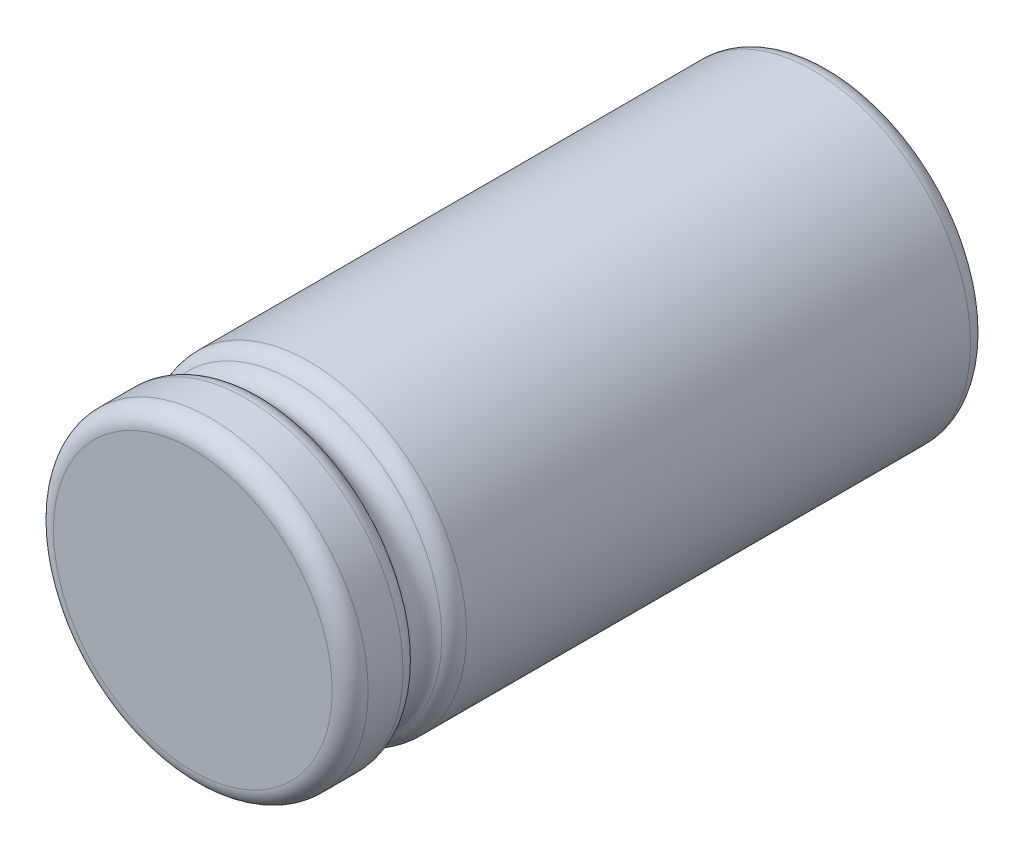
ISO-10303-21;
HEADER;
FILE_DESCRIPTION(('STEP AP214'),'2;1');
FILE_NAME('part.step','',(''),(''),'','','');
FILE_SCHEMA(('AUTOMOTIVE_DESIGN { 1 0 10303 214 1 1 1 1 }'));
ENDSEC;
DATA;
#1=APPLICATION_CONTEXT('core data for automotive mechanical design processes');
#2=APPLICATION_PROTOCOL_DEFINITION('international standard','automotive_design',2000,#1);
#3=PRODUCT_CONTEXT('',#1,'mechanical');
#4=PRODUCT('Part','Part','',(#3));
#5=PRODUCT_RELATED_PRODUCT_CATEGORY('part','',(#4));
#6=PRODUCT_DEFINITION_FORMATION('','',#4);
#7=PRODUCT_DEFINITION_CONTEXT('part definition',#1,'design');
#8=PRODUCT_DEFINITION('design','',#6,#7);
#9=PRODUCT_DEFINITION_SHAPE('','',#8);
#10=(LENGTH_UNIT() NAMED_UNIT(*) SI_UNIT(.MILLI.,.METRE.));
#11=(NAMED_UNIT(*) PLANE_ANGLE_UNIT() SI_UNIT($,.RADIAN.));
#12=(NAMED_UNIT(*) SI_UNIT($,.STERADIAN.) SOLID_ANGLE_UNIT());
#13=UNCERTAINTY_MEASURE_WITH_UNIT(LENGTH_MEASURE(1.E-05),#10,'distance_accuracy_value','');
#14=(GEOMETRIC_REPRESENTATION_CONTEXT(3) GLOBAL_UNCERTAINTY_ASSIGNED_CONTEXT((#13)) GLOBAL_UNIT_ASSIGNED_CONTEXT((#10,
#11,#12)) REPRESENTATION_CONTEXT('',''));
#15=CARTESIAN_POINT('',(0.,0.,0.));
#16=DIRECTION('',(0.,0.,1.));
#17=DIRECTION('',(1.,0.,0.));
#18=AXIS2_PLACEMENT_3D('',#15,#16,#17);
#19=CARTESIAN_POINT('',(0.,0.,71.));
#20=DIRECTION('',(0.,0.,-1.));
#21=DIRECTION('',(-1.,0.,0.));
#22=AXIS2_PLACEMENT_3D('',#19,#20,#21);
#23=CYLINDRICAL_SURFACE('',#22,17.5);
#24=CARTESIAN_POINT('',(0.,0.,58.0557806851903));
#25=DIRECTION('',(0.,0.,-1.));
#26=DIRECTION('',(-1.,0.,0.));
#27=AXIS2_PLACEMENT_3D('',#24,#25,#26);
#28=CIRCLE('',#27,17.5);
#29=CARTESIAN_POINT('',(17.5,0.,58.0557806851903));
#30=VERTEX_POINT('',#29);
#31=EDGE_CURVE('E11',#30,#30,#28,.T.);
#32=ORIENTED_EDGE('',*,*,#31,.T.);
#33=EDGE_LOOP('',(#32));
#34=FACE_BOUND('',#33,.T.);
#35=CARTESIAN_POINT('',(0.,0.,2.));
#36=DIRECTION('',(0.,0.,1.));
#37=DIRECTION('',(1.,0.,0.));
#38=AXIS2_PLACEMENT_3D('',#35,#36,#37);
#39=CIRCLE('',#38,17.5);
#40=CARTESIAN_POINT('',(17.5,0.,2.));
#41=VERTEX_POINT('',#40);
#42=EDGE_CURVE('E83',#41,#41,#39,.T.);
#43=ORIENTED_EDGE('',*,*,#42,.T.);
#44=EDGE_LOOP('',(#43));
#45=FACE_BOUND('',#44,.T.);
#46=ADVANCED_FACE('F37',(#34,#45),#23,.T.);
#47=CARTESIAN_POINT('',(0.,0.,0.));
#48=DIRECTION('',(0.,0.,1.));
#49=DIRECTION('',(1.,0.,0.));
#50=AXIS2_PLACEMENT_3D('',#47,#48,#49);
#51=PLANE('',#50);
#52=CARTESIAN_POINT('',(0.,0.,0.));
#53=DIRECTION('',(0.,0.,1.));
#54=DIRECTION('',(1.,0.,0.));
#55=AXIS2_PLACEMENT_3D('',#52,#53,#54);
#56=CIRCLE('',#55,15.5);
#57=CARTESIAN_POINT('',(15.5,0.,0.));
#58=VERTEX_POINT('',#57);
#59=EDGE_CURVE('E77',#58,#58,#56,.F.);
#60=ORIENTED_EDGE('',*,*,#59,.T.);
#61=EDGE_LOOP('',(#60));
#62=FACE_BOUND('',#61,.T.);
#63=ADVANCED_FACE('F108',(#62),#51,.F.);
#64=CARTESIAN_POINT('',(0.,0.,2.));
#65=DIRECTION('',(0.,0.,1.));
#66=DIRECTION('',(1.,0.,0.));
#67=AXIS2_PLACEMENT_3D('',#64,#65,#66);
#68=TOROIDAL_SURFACE('',#67,15.5,2.);
#69=ORIENTED_EDGE('',*,*,#59,.F.);
#70=EDGE_LOOP('',(#69));
#71=FACE_BOUND('',#70,.T.);
#72=ORIENTED_EDGE('',*,*,#42,.F.);
#73=EDGE_LOOP('',(#72));
#74=FACE_BOUND('',#73,.T.);
#75=ADVANCED_FACE('F113',(#71,#74),#68,.T.);
#76=CARTESIAN_POINT('',(0.,0.,61.5902743049768));
#77=DIRECTION('',(0.,0.,-1.));
#78=DIRECTION('',(-1.,0.,0.));
#79=AXIS2_PLACEMENT_3D('',#76,#77,#78);
#80=TOROIDAL_SURFACE('',#79,17.5,2.06111378174889);
#81=CARTESIAN_POINT('',(17.5,0.,61.5902743049768));
#82=DIRECTION('',(0.,1.,0.));
#83=DIRECTION('',(0.,0.,1.));
#84=AXIS2_PLACEMENT_3D('',#81,#82,#83);
#85=CIRCLE('',#84,2.06111378174889);
#86=CARTESIAN_POINT('',(16.4849514726666,0.,59.7964330331598));
#87=VERTEX_POINT('',#86);
#88=CARTESIAN_POINT('',(16.4849514726666,0.,63.3841155767936));
#89=VERTEX_POINT('',#88);
#90=EDGE_CURVE('E66',#87,#89,#85,.T.);
#91=ORIENTED_EDGE('',*,*,#90,.T.);
#92=CARTESIAN_POINT('',(0.,0.,63.3841155767936));
#93=DIRECTION('',(0.,0.,-1.));
#94=DIRECTION('',(-1.,0.,0.));
#95=AXIS2_PLACEMENT_3D('',#92,#93,#94);
#96=CIRCLE('',#95,16.4849514726665);
#97=EDGE_CURVE('E73',#89,#89,#96,.T.);
#98=ORIENTED_EDGE('',*,*,#97,.T.);
#99=ORIENTED_EDGE('',*,*,#90,.F.);
#100=CARTESIAN_POINT('',(0.,0.,59.7964330331598));
#101=DIRECTION('',(0.,0.,1.));
#102=DIRECTION('',(1.,0.,0.));
#103=AXIS2_PLACEMENT_3D('',#100,#101,#102);
#104=CIRCLE('',#103,16.4849514726665);
#105=EDGE_CURVE('E65',#87,#87,#104,.T.);
#106=ORIENTED_EDGE('',*,*,#105,.T.);
#107=EDGE_LOOP('',(#91,#98,#99,#106));
#108=FACE_BOUND('',#107,.T.);
#109=ADVANCED_FACE('F103',(#108),#80,.F.);
#110=CARTESIAN_POINT('',(0.,0.,71.));
#111=DIRECTION('',(0.,0.,1.));
#112=DIRECTION('',(1.,0.,0.));
#113=AXIS2_PLACEMENT_3D('',#110,#111,#112);
#114=PLANE('',#113);
#115=CARTESIAN_POINT('',(0.,0.,71.));
#116=DIRECTION('',(0.,0.,1.));
#117=DIRECTION('',(1.,0.,0.));
#118=AXIS2_PLACEMENT_3D('',#115,#116,#117);
#119=CIRCLE('',#118,15.5);
#120=CARTESIAN_POINT('',(15.5,0.,71.));
#121=VERTEX_POINT('',#120);
#122=EDGE_CURVE('E68',#121,#121,#119,.T.);
#123=ORIENTED_EDGE('',*,*,#122,.T.);
#124=EDGE_LOOP('',(#123));
#125=FACE_BOUND('',#124,.T.);
#126=ADVANCED_FACE('F89',(#125),#114,.T.);
#127=CARTESIAN_POINT('',(0.,0.,69.));
#128=DIRECTION('',(0.,0.,1.));
#129=DIRECTION('',(1.,0.,0.));
#130=AXIS2_PLACEMENT_3D('',#127,#128,#129);
#131=TOROIDAL_SURFACE('',#130,15.5,2.);
#132=CARTESIAN_POINT('',(0.,0.,69.));
#133=DIRECTION('',(0.,0.,1.));
#134=DIRECTION('',(1.,0.,0.));
#135=AXIS2_PLACEMENT_3D('',#132,#133,#134);
#136=CIRCLE('',#135,17.5);
#137=CARTESIAN_POINT('',(17.5,0.,69.));
#138=VERTEX_POINT('',#137);
#139=EDGE_CURVE('E80',#138,#138,#136,.F.);
#140=ORIENTED_EDGE('',*,*,#139,.F.);
#141=EDGE_LOOP('',(#140));
#142=FACE_BOUND('',#141,.T.);
#143=ORIENTED_EDGE('',*,*,#122,.F.);
#144=EDGE_LOOP('',(#143));
#145=FACE_BOUND('',#144,.T.);
#146=ADVANCED_FACE('F91',(#142,#145),#131,.T.);
#147=CARTESIAN_POINT('',(0.,0.,65.1247679247632));
#148=DIRECTION('',(0.,0.,1.));
#149=DIRECTION('',(1.,0.,0.));
#150=AXIS2_PLACEMENT_3D('',#147,#148,#149);
#151=CIRCLE('',#150,17.5);
#152=CARTESIAN_POINT('',(17.5,0.,65.1247679247632));
#153=VERTEX_POINT('',#152);
#154=EDGE_CURVE('E46',#153,#153,#151,.T.);
#155=ORIENTED_EDGE('',*,*,#154,.T.);
#156=EDGE_LOOP('',(#155));
#157=FACE_BOUND('',#156,.T.);
#158=ORIENTED_EDGE('',*,*,#139,.T.);
#159=EDGE_LOOP('',(#158));
#160=FACE_BOUND('',#159,.T.);
#161=ADVANCED_FACE('F93',(#157,#160),#23,.T.);
#162=CARTESIAN_POINT('',(0.,0.,65.1247679247632));
#163=DIRECTION('',(0.,0.,1.));
#164=DIRECTION('',(1.,0.,0.));
#165=AXIS2_PLACEMENT_3D('',#162,#163,#164);
#166=TOROIDAL_SURFACE('',#165,15.5,2.);
#167=CARTESIAN_POINT('',(15.5,0.,65.1247679247632));
#168=DIRECTION('',(0.,1.,0.));
#169=DIRECTION('',(0.,0.,1.));
#170=AXIS2_PLACEMENT_3D('',#167,#168,#169);
#171=CIRCLE('',#170,2.);
#172=EDGE_CURVE('E60',#153,#89,#171,.T.);
#173=ORIENTED_EDGE('',*,*,#172,.F.);
#174=ORIENTED_EDGE('',*,*,#154,.F.);
#175=ORIENTED_EDGE('',*,*,#172,.T.);
#176=ORIENTED_EDGE('',*,*,#97,.F.);
#177=EDGE_LOOP('',(#173,#174,#175,#176));
#178=FACE_BOUND('',#177,.T.);
#179=ADVANCED_FACE('F100',(#178),#166,.T.);
#180=CARTESIAN_POINT('',(0.,0.,58.0557806851903));
#181=DIRECTION('',(0.,0.,-1.));
#182=DIRECTION('',(-1.,0.,0.));
#183=AXIS2_PLACEMENT_3D('',#180,#181,#182);
#184=TOROIDAL_SURFACE('',#183,15.5,2.);
#185=CARTESIAN_POINT('',(15.5,0.,58.0557806851903));
#186=DIRECTION('',(0.,-1.,0.));
#187=DIRECTION('',(0.,0.,-1.));
#188=AXIS2_PLACEMENT_3D('',#185,#186,#187);
#189=CIRCLE('',#188,2.);
#190=EDGE_CURVE('E41',#30,#87,#189,.T.);
#191=ORIENTED_EDGE('',*,*,#190,.F.);
#192=ORIENTED_EDGE('',*,*,#31,.F.);
#193=ORIENTED_EDGE('',*,*,#190,.T.);
#194=ORIENTED_EDGE('',*,*,#105,.F.);
#195=EDGE_LOOP('',(#191,#192,#193,#194));
#196=FACE_BOUND('',#195,.T.);
#197=ADVANCED_FACE('F39',(#196),#184,.T.);
#198=CLOSED_SHELL('',(#46,#63,#75,#109,#126,#146,#161,#179,#197));
#199=MANIFOLD_SOLID_BREP('B2',#198);
#200=ADVANCED_BREP_SHAPE_REPRESENTATION('',(#18,#199),#14);
#201=SHAPE_DEFINITION_REPRESENTATION(#9,#200);
ENDSEC;
END-ISO-10303-21;
